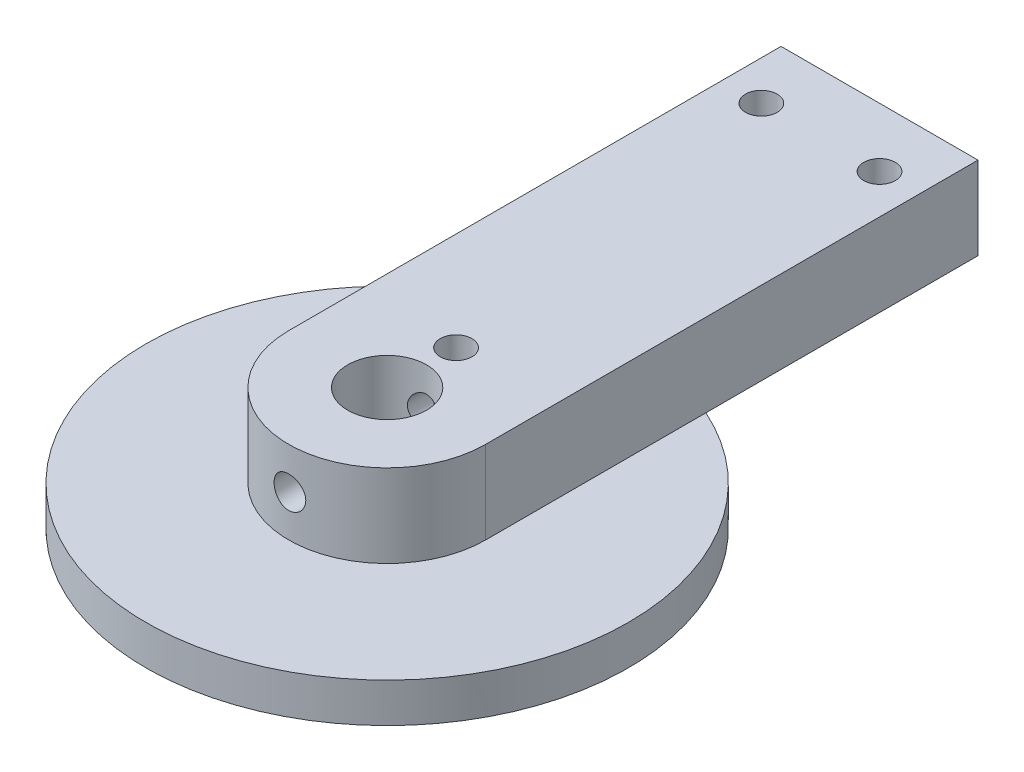
ISO-10303-21;
HEADER;
FILE_DESCRIPTION(('STEP AP214'),'2;1');
FILE_NAME('part.step','',(''),(''),'','','');
FILE_SCHEMA(('AUTOMOTIVE_DESIGN { 1 0 10303 214 1 1 1 1 }'));
ENDSEC;
DATA;
#1=APPLICATION_CONTEXT('core data for automotive mechanical design processes');
#2=APPLICATION_PROTOCOL_DEFINITION('international standard','automotive_design',2000,#1);
#3=PRODUCT_CONTEXT('',#1,'mechanical');
#4=PRODUCT('Part','Part','',(#3));
#5=PRODUCT_RELATED_PRODUCT_CATEGORY('part','',(#4));
#6=PRODUCT_DEFINITION_FORMATION('','',#4);
#7=PRODUCT_DEFINITION_CONTEXT('part definition',#1,'design');
#8=PRODUCT_DEFINITION('design','',#6,#7);
#9=PRODUCT_DEFINITION_SHAPE('','',#8);
#10=(LENGTH_UNIT() NAMED_UNIT(*) SI_UNIT(.MILLI.,.METRE.));
#11=(NAMED_UNIT(*) PLANE_ANGLE_UNIT() SI_UNIT($,.RADIAN.));
#12=(NAMED_UNIT(*) SI_UNIT($,.STERADIAN.) SOLID_ANGLE_UNIT());
#13=UNCERTAINTY_MEASURE_WITH_UNIT(LENGTH_MEASURE(1.E-05),#10,'distance_accuracy_value','');
#14=(GEOMETRIC_REPRESENTATION_CONTEXT(3) GLOBAL_UNCERTAINTY_ASSIGNED_CONTEXT((#13)) GLOBAL_UNIT_ASSIGNED_CONTEXT((#10,
#11,#12)) REPRESENTATION_CONTEXT('',''));
#15=CARTESIAN_POINT('',(0.,0.,0.));
#16=DIRECTION('',(0.,0.,1.));
#17=DIRECTION('',(1.,0.,0.));
#18=AXIS2_PLACEMENT_3D('',#15,#16,#17);
#19=CARTESIAN_POINT('',(0.,6.67619513536902,-79.375));
#20=DIRECTION('',(0.,0.,-1.));
#21=DIRECTION('',(-1.,0.,0.));
#22=AXIS2_PLACEMENT_3D('',#19,#20,#21);
#23=CYLINDRICAL_SURFACE('',#22,2.55269999999998);
#24=CARTESIAN_POINT('',(0.,6.67619513536902,-79.375));
#25=DIRECTION('',(0.,0.,-1.));
#26=DIRECTION('',(-1.,0.,0.));
#27=AXIS2_PLACEMENT_3D('',#24,#25,#26);
#28=CIRCLE('',#27,2.55269999999999);
#29=CARTESIAN_POINT('',(-2.55269999999999,6.67619513536902,-79.375));
#30=VERTEX_POINT('',#29);
#31=EDGE_CURVE('E142',#30,#30,#28,.T.);
#32=ORIENTED_EDGE('',*,*,#31,.T.);
#33=EDGE_LOOP('',(#32));
#34=FACE_BOUND('',#33,.T.);
#35=CARTESIAN_POINT('',(0.,6.67619513536902,-11.1125));
#36=DIRECTION('',(0.,-0.707106781186547,-0.707106781186547));
#37=DIRECTION('',(0.,0.707106781186547,-0.707106781186547));
#38=AXIS2_PLACEMENT_3D('',#35,#36,#37);
#39=ELLIPSE('',#38,3.61006296066977,2.55269999999998);
#40=CARTESIAN_POINT('',(2.55269999999998,6.67619513536902,-11.1125));
#41=VERTEX_POINT('',#40);
#42=CARTESIAN_POINT('',(-2.55269999999998,6.67619513536902,-11.1125));
#43=VERTEX_POINT('',#42);
#44=EDGE_CURVE('E52',#41,#43,#39,.F.);
#45=ORIENTED_EDGE('',*,*,#44,.T.);
#46=CARTESIAN_POINT('',(0.,6.67619513536902,-11.1125));
#47=DIRECTION('',(0.,0.707106781186547,-0.707106781186547));
#48=DIRECTION('',(0.,-0.707106781186547,-0.707106781186547));
#49=AXIS2_PLACEMENT_3D('',#46,#47,#48);
#50=ELLIPSE('',#49,3.61006296066977,2.55269999999998);
#51=EDGE_CURVE('E12',#43,#41,#50,.F.);
#52=ORIENTED_EDGE('',*,*,#51,.T.);
#53=EDGE_LOOP('',(#45,#52));
#54=FACE_BOUND('',#53,.T.);
#55=ADVANCED_FACE('F38',(#34,#54),#23,.F.);
#56=CARTESIAN_POINT('',(0.,-4.7625,0.));
#57=DIRECTION('',(0.,-1.,0.));
#58=DIRECTION('',(0.,0.,-1.));
#59=AXIS2_PLACEMENT_3D('',#56,#57,#58);
#60=PLANE('',#59);
#61=CARTESIAN_POINT('',(0.,-4.7625,-11.1125));
#62=DIRECTION('',(0.,-1.,0.));
#63=DIRECTION('',(0.,0.,-1.));
#64=AXIS2_PLACEMENT_3D('',#61,#62,#63);
#65=CIRCLE('',#64,2.55269999999998);
#66=CARTESIAN_POINT('',(0.,-4.7625,-13.6652));
#67=VERTEX_POINT('',#66);
#68=EDGE_CURVE('E445',#67,#67,#65,.T.);
#69=ORIENTED_EDGE('',*,*,#68,.F.);
#70=EDGE_LOOP('',(#69));
#71=FACE_BOUND('',#70,.T.);
#72=CARTESIAN_POINT('',(0.,-4.7625,0.));
#73=DIRECTION('',(0.,1.,0.));
#74=DIRECTION('',(0.,0.,1.));
#75=AXIS2_PLACEMENT_3D('',#72,#73,#74);
#76=CIRCLE('',#75,6.35);
#77=CARTESIAN_POINT('',(0.,-4.7625,6.35));
#78=VERTEX_POINT('',#77);
#79=EDGE_CURVE('E149',#78,#78,#76,.T.);
#80=ORIENTED_EDGE('',*,*,#79,.T.);
#81=EDGE_LOOP('',(#80));
#82=FACE_BOUND('',#81,.T.);
#83=CARTESIAN_POINT('',(0.,-4.7625,0.));
#84=DIRECTION('',(0.,-1.,0.));
#85=DIRECTION('',(0.,0.,-1.));
#86=AXIS2_PLACEMENT_3D('',#83,#84,#85);
#87=CIRCLE('',#86,28.575);
#88=CARTESIAN_POINT('',(0.,-4.7625,-28.575));
#89=VERTEX_POINT('',#88);
#90=EDGE_CURVE('E101',#89,#89,#87,.F.);
#91=ORIENTED_EDGE('',*,*,#90,.F.);
#92=EDGE_LOOP('',(#91));
#93=FACE_BOUND('',#92,.T.);
#94=ADVANCED_FACE('F225',(#71,#82,#93),#60,.T.);
#95=CARTESIAN_POINT('',(0.,13.352390270738,0.));
#96=DIRECTION('',(0.,-1.,0.));
#97=DIRECTION('',(0.,0.,-1.));
#98=AXIS2_PLACEMENT_3D('',#95,#96,#97);
#99=CYLINDRICAL_SURFACE('',#98,15.875);
#100=CARTESIAN_POINT('',(-2.55269999999998,6.67619513536902,15.6684188005682));
#101=CARTESIAN_POINT('',(-2.55269421702429,6.81858337057183,15.6684213075761));
#102=CARTESIAN_POINT('',(-2.54074616648937,6.96105114669729,15.6703807733375));
#103=CARTESIAN_POINT('',(-2.49328747696049,7.24199445458756,15.6780004485777));
#104=CARTESIAN_POINT('',(-2.45775465288336,7.38046609928677,15.6836641423756));
#105=CARTESIAN_POINT('',(-2.3642246898089,7.64931035266627,15.6980345886033));
#106=CARTESIAN_POINT('',(-2.30624576638418,7.77968942937338,15.7067388729595));
#107=CARTESIAN_POINT('',(-2.16951391110434,8.02885321213302,15.7262068260587));
#108=CARTESIAN_POINT('',(-2.09076350622437,8.14763932613227,15.736970244252));
#109=CARTESIAN_POINT('',(-1.91395239807692,8.37135180737435,15.7594541669231));
#110=CARTESIAN_POINT('',(-1.81573834039578,8.47615626975943,15.7711818089928));
#111=CARTESIAN_POINT('',(-1.6031191944537,8.6678724748529,15.7942092572758));
#112=CARTESIAN_POINT('',(-1.48871317289836,8.75478318546759,15.80550903878));
#113=CARTESIAN_POINT('',(-1.24617092916904,8.90869960464129,15.8264828230326));
#114=CARTESIAN_POINT('',(-1.11796209880441,8.97559228132801,15.8361474645452));
#115=CARTESIAN_POINT('',(-0.851946766463865,9.08684769434277,15.8526827295399));
#116=CARTESIAN_POINT('',(-0.714140846441996,9.13121179542165,15.8595535222646));
#117=CARTESIAN_POINT('',(-0.434101249094811,9.1957790415053,15.8696765615113));
#118=CARTESIAN_POINT('',(-0.291915868756529,9.21618677955503,15.8729594328297));
#119=CARTESIAN_POINT('',(-0.00610368480078618,9.23289786165674,15.8756418646554));
#120=CARTESIAN_POINT('',(0.137523026746744,9.22920273569771,15.8750416716497));
#121=CARTESIAN_POINT('',(0.420743073143736,9.19797322666551,15.8700499252344));
#122=CARTESIAN_POINT('',(0.560361388754155,9.17065899890702,15.8656933860675));
#123=CARTESIAN_POINT('',(0.833006837524951,9.09331290569467,15.8537174689452));
#124=CARTESIAN_POINT('',(0.966033780853808,9.04328038637532,15.8460979970781));
#125=CARTESIAN_POINT('',(1.22237929250029,8.9216967681155,15.8283925067598));
#126=CARTESIAN_POINT('',(1.34565374559465,8.85005424018152,15.818296043058));
#127=CARTESIAN_POINT('',(1.57851407372252,8.68735117090641,15.7967595883054));
#128=CARTESIAN_POINT('',(1.68809891484346,8.59628916430693,15.7853194959031));
#129=CARTESIAN_POINT('',(1.8917689753526,8.39610901610732,15.7622168215726));
#130=CARTESIAN_POINT('',(1.98566512265019,8.286798527095,15.7505531861649));
#131=CARTESIAN_POINT('',(2.15381262182836,8.05387438806735,15.7284433673805));
#132=CARTESIAN_POINT('',(2.22806381592379,7.93026062318184,15.7179971937827));
#133=CARTESIAN_POINT('',(2.3548466137178,7.67202768294993,15.6995048081101));
#134=CARTESIAN_POINT('',(2.40735666600635,7.53739774509266,15.6914609796055));
#135=CARTESIAN_POINT('',(2.48896516765669,7.26107055321859,15.6787244285256));
#136=CARTESIAN_POINT('',(2.51806552755095,7.11937387694128,15.6740314324827));
#137=CARTESIAN_POINT('',(2.55176488015591,6.83462369590792,15.6685804494066));
#138=CARTESIAN_POINT('',(2.55663285023611,6.69160282328911,15.6677792660236));
#139=CARTESIAN_POINT('',(2.54244490894016,6.40678908925925,15.6700877012313));
#140=CARTESIAN_POINT('',(2.5233898551273,6.26499618401299,15.6731971796375));
#141=CARTESIAN_POINT('',(2.46212566734739,5.9875100947066,15.682936752433));
#142=CARTESIAN_POINT('',(2.42005238780704,5.85178612711247,15.6895461827001));
#143=CARTESIAN_POINT('',(2.31408811272271,5.58931586563896,15.705523712824));
#144=CARTESIAN_POINT('',(2.25019589379056,5.46257007564735,15.7148919673639));
#145=CARTESIAN_POINT('',(2.10176843471217,5.22045376670255,15.7354324591804));
#146=CARTESIAN_POINT('',(2.01706019026241,5.10519058778602,15.7466195346261));
#147=CARTESIAN_POINT('',(1.8296437947844,4.89041884236245,15.7694933040337));
#148=CARTESIAN_POINT('',(1.72693446847435,4.79091130534146,15.7811800305799));
#149=CARTESIAN_POINT('',(1.50524233629351,4.60949919510091,15.8038723483787));
#150=CARTESIAN_POINT('',(1.38611217405467,4.52777359546783,15.8148702858739));
#151=CARTESIAN_POINT('',(1.13565716043419,4.38549642641893,15.8348244904014));
#152=CARTESIAN_POINT('',(1.00433268219725,4.32494420937002,15.8437808198778));
#153=CARTESIAN_POINT('',(0.73375836410508,4.22701388871142,15.8586093102595));
#154=CARTESIAN_POINT('',(0.594543695370145,4.18954060727633,15.8644941226018));
#155=CARTESIAN_POINT('',(0.311695277823733,4.13852482483949,15.8725698708882));
#156=CARTESIAN_POINT('',(0.168061867287679,4.12498049657938,15.8747610888814));
#157=CARTESIAN_POINT('',(-0.117816353701131,4.12225677676087,15.8751991931853));
#158=CARTESIAN_POINT('',(-0.260058571128707,4.13280452240284,15.8734902522255));
#159=CARTESIAN_POINT('',(-0.540717899904298,4.17737728344147,15.8664098270789));
#160=CARTESIAN_POINT('',(-0.67913502915253,4.21140218895302,15.8610383600346));
#161=CARTESIAN_POINT('',(-0.948121419231941,4.30186154637854,15.847234005968));
#162=CARTESIAN_POINT('',(-1.0786981204829,4.35827435288604,15.8388040766476));
#163=CARTESIAN_POINT('',(-1.3285753097415,4.49187827503799,15.8198050943369));
#164=CARTESIAN_POINT('',(-1.44787532324973,4.56907026450156,15.8092359513916));
#165=CARTESIAN_POINT('',(-1.67319071262124,4.74301577798607,15.7869892769831));
#166=CARTESIAN_POINT('',(-1.77905031266291,4.83996974053222,15.7753010974093));
#167=CARTESIAN_POINT('',(-1.97309486630058,5.05026575084303,15.7522092161064));
#168=CARTESIAN_POINT('',(-2.06127567317059,5.16361163277851,15.7408055816679));
#169=CARTESIAN_POINT('',(-2.21798489878607,5.40435067877194,15.7194936775308));
#170=CARTESIAN_POINT('',(-2.28638114752128,5.53183078661779,15.7095956651329));
#171=CARTESIAN_POINT('',(-2.40068555374764,5.79657456252965,15.6925365184406));
#172=CARTESIAN_POINT('',(-2.44661649519712,5.93382815591365,15.6853726128857));
#173=CARTESIAN_POINT('',(-2.50454732687514,6.17240491253714,15.6762058286717));
#174=CARTESIAN_POINT('',(-2.52257610162269,6.2722725397377,15.6733016531558));
#175=CARTESIAN_POINT('',(-2.54665440016736,6.47347839850198,15.669407262079));
#176=CARTESIAN_POINT('',(-2.55270411740173,6.57481660629221,15.668417015612));
#177=CARTESIAN_POINT('',(-2.55269999999998,6.67619513536902,15.6684188005682));
#178=B_SPLINE_CURVE_WITH_KNOTS('',3,(#100,#101,#102,#103,#104,#105,#106,#107,#108,#109,#110,
#111,#112,#113,#114,#115,#116,#117,#118,#119,#120,#121,#122,#123,#124,#125,#126,#127,#128,#129,
#130,#131,#132,#133,#134,#135,#136,#137,#138,#139,#140,#141,#142,#143,#144,#145,#146,#147,#148,
#149,#150,#151,#152,#153,#154,#155,#156,#157,#158,#159,#160,#161,#162,#163,#164,#165,#166,#167,
#168,#169,#170,#171,#172,#173,#174,#175,#176,#177),.UNSPECIFIED.,.T.,.F.,(4,2,2,2,2,2,2,2,2,2,2,
2,2,2,2,2,2,2,2,2,2,2,2,2,2,2,2,2,2,2,2,2,2,2,2,2,2,2,4),(0.,0.426794046832573,
0.853990128709808,1.28084025451386,1.70763847537528,2.13794366991312,2.56827367707512,
3.00098958348056,3.43367927340975,3.86264616780719,4.29158583273367,4.71656989801847,
5.14156619573863,5.568386434729,5.99523888999784,6.42691319835398,6.85859097374436,
7.2906956411128,7.72276503959478,8.15002764276479,8.57727493038522,9.00202737321335,
9.42680363582704,9.85523731672571,10.2836989802764,10.7162917565423,11.1488712998773,
11.5796547200504,12.0104052433967,12.4363013825917,12.8621955283883,13.2876789040767,
13.7131801752523,14.1432335454077,14.5733876708807,15.0063523528909,15.43887701376,
15.7427536038985,16.0466252870119),.UNSPECIFIED.);
#179=CARTESIAN_POINT('',(-2.55269999999998,6.67619513536902,15.6684188005682));
#180=VERTEX_POINT('',#179);
#181=EDGE_CURVE('E114',#180,#180,#178,.T.);
#182=ORIENTED_EDGE('',*,*,#181,.T.);
#183=EDGE_LOOP('',(#182));
#184=FACE_BOUND('',#183,.T.);
#185=CARTESIAN_POINT('',(0.,0.,0.));
#186=DIRECTION('',(0.,1.,0.));
#187=DIRECTION('',(0.,0.,1.));
#188=AXIS2_PLACEMENT_3D('',#185,#186,#187);
#189=CIRCLE('',#188,15.875);
#190=CARTESIAN_POINT('',(-15.875,0.,0.));
#191=VERTEX_POINT('',#190);
#192=CARTESIAN_POINT('',(15.875,0.,0.));
#193=VERTEX_POINT('',#192);
#194=EDGE_CURVE('E158',#191,#193,#189,.T.);
#195=ORIENTED_EDGE('',*,*,#194,.T.);
#196=DIRECTION('',(0.,-1.,0.));
#197=VECTOR('',#196,1.);
#198=CARTESIAN_POINT('',(15.875,13.352390270738,0.));
#199=LINE('',#198,#197);
#200=CARTESIAN_POINT('',(15.875,13.352390270738,0.));
#201=VERTEX_POINT('',#200);
#202=EDGE_CURVE('E187',#201,#193,#199,.T.);
#203=ORIENTED_EDGE('',*,*,#202,.F.);
#204=CARTESIAN_POINT('',(0.,13.352390270738,0.));
#205=DIRECTION('',(0.,1.,0.));
#206=DIRECTION('',(0.,0.,1.));
#207=AXIS2_PLACEMENT_3D('',#204,#205,#206);
#208=CIRCLE('',#207,15.875);
#209=CARTESIAN_POINT('',(-15.875,13.352390270738,0.));
#210=VERTEX_POINT('',#209);
#211=EDGE_CURVE('E159',#210,#201,#208,.T.);
#212=ORIENTED_EDGE('',*,*,#211,.F.);
#213=DIRECTION('',(0.,-1.,0.));
#214=VECTOR('',#213,1.);
#215=CARTESIAN_POINT('',(-15.875,13.352390270738,0.));
#216=LINE('',#215,#214);
#217=EDGE_CURVE('E169',#210,#191,#216,.T.);
#218=ORIENTED_EDGE('',*,*,#217,.T.);
#219=EDGE_LOOP('',(#195,#203,#212,#218));
#220=FACE_BOUND('',#219,.T.);
#221=ADVANCED_FACE('F40',(#184,#220),#99,.T.);
#222=CARTESIAN_POINT('',(15.875,13.352390270738,-79.375));
#223=DIRECTION('',(-1.,0.,0.));
#224=DIRECTION('',(0.,0.,1.));
#225=AXIS2_PLACEMENT_3D('',#222,#223,#224);
#226=PLANE('',#225);
#227=DIRECTION('',(0.,0.,-1.));
#228=VECTOR('',#227,1.);
#229=CARTESIAN_POINT('',(15.875,0.,-79.375));
#230=LINE('',#229,#228);
#231=CARTESIAN_POINT('',(15.875,0.,-35.5064524285728));
#232=VERTEX_POINT('',#231);
#233=EDGE_CURVE('E173',#193,#232,#230,.T.);
#234=ORIENTED_EDGE('',*,*,#233,.T.);
#235=CARTESIAN_POINT('',(15.875,0.,-79.375));
#236=VERTEX_POINT('',#235);
#237=EDGE_CURVE('E172',#232,#236,#230,.T.);
#238=ORIENTED_EDGE('',*,*,#237,.T.);
#239=DIRECTION('',(0.,-1.,0.));
#240=VECTOR('',#239,1.);
#241=CARTESIAN_POINT('',(15.875,13.352390270738,-79.375));
#242=LINE('',#241,#240);
#243=CARTESIAN_POINT('',(15.875,13.352390270738,-79.375));
#244=VERTEX_POINT('',#243);
#245=EDGE_CURVE('E184',#244,#236,#242,.T.);
#246=ORIENTED_EDGE('',*,*,#245,.F.);
#247=DIRECTION('',(0.,0.,-1.));
#248=VECTOR('',#247,1.);
#249=CARTESIAN_POINT('',(15.875,13.352390270738,-79.375));
#250=LINE('',#249,#248);
#251=EDGE_CURVE('E162',#201,#244,#250,.T.);
#252=ORIENTED_EDGE('',*,*,#251,.F.);
#253=ORIENTED_EDGE('',*,*,#202,.T.);
#254=EDGE_LOOP('',(#234,#238,#246,#252,#253));
#255=FACE_BOUND('',#254,.T.);
#256=ADVANCED_FACE('F217',(#255),#226,.F.);
#257=CARTESIAN_POINT('',(-15.875,13.352390270738,-79.375));
#258=DIRECTION('',(0.,0.,1.));
#259=DIRECTION('',(1.,0.,0.));
#260=AXIS2_PLACEMENT_3D('',#257,#258,#259);
#261=PLANE('',#260);
#262=ORIENTED_EDGE('',*,*,#31,.F.);
#263=EDGE_LOOP('',(#262));
#264=FACE_BOUND('',#263,.T.);
#265=DIRECTION('',(-1.,0.,0.));
#266=VECTOR('',#265,1.);
#267=CARTESIAN_POINT('',(-15.875,0.,-79.375));
#268=LINE('',#267,#266);
#269=CARTESIAN_POINT('',(-15.875,0.,-79.375));
#270=VERTEX_POINT('',#269);
#271=EDGE_CURVE('E175',#236,#270,#268,.T.);
#272=ORIENTED_EDGE('',*,*,#271,.T.);
#273=DIRECTION('',(0.,-1.,0.));
#274=VECTOR('',#273,1.);
#275=CARTESIAN_POINT('',(-15.875,13.352390270738,-79.375));
#276=LINE('',#275,#274);
#277=CARTESIAN_POINT('',(-15.875,13.352390270738,-79.375));
#278=VERTEX_POINT('',#277);
#279=EDGE_CURVE('E181',#278,#270,#276,.T.);
#280=ORIENTED_EDGE('',*,*,#279,.F.);
#281=DIRECTION('',(-1.,0.,0.));
#282=VECTOR('',#281,1.);
#283=CARTESIAN_POINT('',(-15.875,13.352390270738,-79.375));
#284=LINE('',#283,#282);
#285=EDGE_CURVE('E165',#244,#278,#284,.T.);
#286=ORIENTED_EDGE('',*,*,#285,.F.);
#287=ORIENTED_EDGE('',*,*,#245,.T.);
#288=EDGE_LOOP('',(#272,#280,#286,#287));
#289=FACE_BOUND('',#288,.T.);
#290=ADVANCED_FACE('F215',(#264,#289),#261,.F.);
#291=CARTESIAN_POINT('',(-15.875,13.352390270738,0.));
#292=DIRECTION('',(1.,0.,0.));
#293=DIRECTION('',(0.,0.,-1.));
#294=AXIS2_PLACEMENT_3D('',#291,#292,#293);
#295=PLANE('',#294);
#296=DIRECTION('',(0.,0.,1.));
#297=VECTOR('',#296,1.);
#298=CARTESIAN_POINT('',(-15.875,0.,0.));
#299=LINE('',#298,#297);
#300=CARTESIAN_POINT('',(-15.875,0.,-35.5064524285728));
#301=VERTEX_POINT('',#300);
#302=EDGE_CURVE('E163',#270,#301,#299,.T.);
#303=ORIENTED_EDGE('',*,*,#302,.T.);
#304=EDGE_CURVE('E177',#301,#191,#299,.T.);
#305=ORIENTED_EDGE('',*,*,#304,.T.);
#306=ORIENTED_EDGE('',*,*,#217,.F.);
#307=DIRECTION('',(0.,0.,1.));
#308=VECTOR('',#307,1.);
#309=CARTESIAN_POINT('',(-15.875,13.352390270738,0.));
#310=LINE('',#309,#308);
#311=EDGE_CURVE('E167',#278,#210,#310,.T.);
#312=ORIENTED_EDGE('',*,*,#311,.F.);
#313=ORIENTED_EDGE('',*,*,#279,.T.);
#314=EDGE_LOOP('',(#303,#305,#306,#312,#313));
#315=FACE_BOUND('',#314,.T.);
#316=ADVANCED_FACE('F202',(#315),#295,.F.);
#317=CARTESIAN_POINT('',(0.,13.352390270738,0.));
#318=DIRECTION('',(0.,1.,0.));
#319=DIRECTION('',(0.,0.,1.));
#320=AXIS2_PLACEMENT_3D('',#317,#318,#319);
#321=PLANE('',#320);
#322=CARTESIAN_POINT('',(-9.52500000003406,13.3523902707381,-69.8499999999932));
#323=DIRECTION('',(0.,1.,0.));
#324=DIRECTION('',(0.,0.,1.));
#325=AXIS2_PLACEMENT_3D('',#322,#323,#324);
#326=CIRCLE('',#325,2.55269999999999);
#327=CARTESIAN_POINT('',(-9.52500000003406,13.3523902707381,-67.2972999999932));
#328=VERTEX_POINT('',#327);
#329=EDGE_CURVE('E430',#328,#328,#326,.T.);
#330=ORIENTED_EDGE('',*,*,#329,.F.);
#331=EDGE_LOOP('',(#330));
#332=FACE_BOUND('',#331,.T.);
#333=CARTESIAN_POINT('',(9.52499999996594,13.3523902707381,-69.8499999999932));
#334=DIRECTION('',(0.,1.,0.));
#335=DIRECTION('',(0.,0.,1.));
#336=AXIS2_PLACEMENT_3D('',#333,#334,#335);
#337=CIRCLE('',#336,2.55269999999999);
#338=CARTESIAN_POINT('',(9.52499999996594,13.3523902707381,-67.2972999999932));
#339=VERTEX_POINT('',#338);
#340=EDGE_CURVE('E434',#339,#339,#337,.T.);
#341=ORIENTED_EDGE('',*,*,#340,.F.);
#342=EDGE_LOOP('',(#341));
#343=FACE_BOUND('',#342,.T.);
#344=CARTESIAN_POINT('',(0.,13.3523902707381,-11.1125));
#345=DIRECTION('',(0.,1.,0.));
#346=DIRECTION('',(0.,0.,1.));
#347=AXIS2_PLACEMENT_3D('',#344,#345,#346);
#348=CIRCLE('',#347,2.55269999999999);
#349=CARTESIAN_POINT('',(0.,13.3523902707381,-8.5598));
#350=VERTEX_POINT('',#349);
#351=EDGE_CURVE('E443',#350,#350,#348,.T.);
#352=ORIENTED_EDGE('',*,*,#351,.F.);
#353=EDGE_LOOP('',(#352));
#354=FACE_BOUND('',#353,.T.);
#355=CARTESIAN_POINT('',(0.,13.352390270738,0.));
#356=DIRECTION('',(0.,1.,0.));
#357=DIRECTION('',(0.,0.,1.));
#358=AXIS2_PLACEMENT_3D('',#355,#356,#357);
#359=CIRCLE('',#358,6.35);
#360=CARTESIAN_POINT('',(0.,13.352390270738,6.35));
#361=VERTEX_POINT('',#360);
#362=EDGE_CURVE('E152',#361,#361,#359,.T.);
#363=ORIENTED_EDGE('',*,*,#362,.F.);
#364=EDGE_LOOP('',(#363));
#365=FACE_BOUND('',#364,.T.);
#366=ORIENTED_EDGE('',*,*,#211,.T.);
#367=ORIENTED_EDGE('',*,*,#251,.T.);
#368=ORIENTED_EDGE('',*,*,#285,.T.);
#369=ORIENTED_EDGE('',*,*,#311,.T.);
#370=EDGE_LOOP('',(#366,#367,#368,#369));
#371=FACE_BOUND('',#370,.T.);
#372=ADVANCED_FACE('F208',(#332,#343,#354,#365,#371),#321,.T.);
#373=CARTESIAN_POINT('',(0.,0.,0.));
#374=DIRECTION('',(0.,1.,0.));
#375=DIRECTION('',(0.,0.,1.));
#376=AXIS2_PLACEMENT_3D('',#373,#374,#375);
#377=PLANE('',#376);
#378=CARTESIAN_POINT('',(-9.52500000003406,0.,-69.8499999999932));
#379=DIRECTION('',(0.,1.,0.));
#380=DIRECTION('',(0.,0.,1.));
#381=AXIS2_PLACEMENT_3D('',#378,#379,#380);
#382=CIRCLE('',#381,2.55269999999998);
#383=CARTESIAN_POINT('',(-9.52500000003406,0.,-67.2972999999932));
#384=VERTEX_POINT('',#383);
#385=EDGE_CURVE('E433',#384,#384,#382,.T.);
#386=ORIENTED_EDGE('',*,*,#385,.T.);
#387=EDGE_LOOP('',(#386));
#388=FACE_BOUND('',#387,.T.);
#389=CARTESIAN_POINT('',(9.52499999996594,0.,-69.8499999999932));
#390=DIRECTION('',(0.,1.,0.));
#391=DIRECTION('',(0.,0.,1.));
#392=AXIS2_PLACEMENT_3D('',#389,#390,#391);
#393=CIRCLE('',#392,2.55269999999998);
#394=CARTESIAN_POINT('',(9.52499999996594,0.,-67.2972999999932));
#395=VERTEX_POINT('',#394);
#396=EDGE_CURVE('E437',#395,#395,#393,.T.);
#397=ORIENTED_EDGE('',*,*,#396,.T.);
#398=EDGE_LOOP('',(#397));
#399=FACE_BOUND('',#398,.T.);
#400=CARTESIAN_POINT('',(0.,0.,0.));
#401=DIRECTION('',(0.,-1.,0.));
#402=DIRECTION('',(0.,0.,-1.));
#403=AXIS2_PLACEMENT_3D('',#400,#401,#402);
#404=CIRCLE('',#403,38.89375);
#405=EDGE_CURVE('E60',#301,#232,#404,.T.);
#406=ORIENTED_EDGE('',*,*,#405,.F.);
#407=ORIENTED_EDGE('',*,*,#302,.F.);
#408=ORIENTED_EDGE('',*,*,#271,.F.);
#409=ORIENTED_EDGE('',*,*,#237,.F.);
#410=EDGE_LOOP('',(#406,#407,#408,#409));
#411=FACE_BOUND('',#410,.T.);
#412=ADVANCED_FACE('F214',(#388,#399,#411),#377,.F.);
#413=CARTESIAN_POINT('',(0.,-4.7625,0.));
#414=DIRECTION('',(0.,1.,0.));
#415=DIRECTION('',(0.,0.,1.));
#416=AXIS2_PLACEMENT_3D('',#413,#414,#415);
#417=CYLINDRICAL_SURFACE('',#416,38.89375);
#418=EDGE_CURVE('E155',#232,#301,#404,.T.);
#419=ORIENTED_EDGE('',*,*,#418,.T.);
#420=ORIENTED_EDGE('',*,*,#405,.T.);
#421=EDGE_LOOP('',(#419,#420));
#422=FACE_BOUND('',#421,.T.);
#423=CARTESIAN_POINT('',(0.,-6.35,0.));
#424=DIRECTION('',(0.,-1.,0.));
#425=DIRECTION('',(0.,0.,-1.));
#426=AXIS2_PLACEMENT_3D('',#423,#424,#425);
#427=CIRCLE('',#426,38.89375);
#428=CARTESIAN_POINT('',(0.,-6.35,-38.89375));
#429=VERTEX_POINT('',#428);
#430=EDGE_CURVE('E146',#429,#429,#427,.T.);
#431=ORIENTED_EDGE('',*,*,#430,.F.);
#432=EDGE_LOOP('',(#431));
#433=FACE_BOUND('',#432,.T.);
#434=ADVANCED_FACE('F193',(#422,#433),#417,.T.);
#435=CARTESIAN_POINT('',(0.,0.,0.));
#436=DIRECTION('',(0.,-1.,0.));
#437=DIRECTION('',(0.,0.,-1.));
#438=AXIS2_PLACEMENT_3D('',#435,#436,#437);
#439=PLANE('',#438);
#440=ORIENTED_EDGE('',*,*,#304,.F.);
#441=ORIENTED_EDGE('',*,*,#418,.F.);
#442=ORIENTED_EDGE('',*,*,#233,.F.);
#443=ORIENTED_EDGE('',*,*,#194,.F.);
#444=EDGE_LOOP('',(#440,#441,#442,#443));
#445=FACE_BOUND('',#444,.T.);
#446=ADVANCED_FACE('F198',(#445),#439,.F.);
#447=CARTESIAN_POINT('',(0.,-4.7625,0.));
#448=DIRECTION('',(0.,1.,0.));
#449=DIRECTION('',(0.,0.,1.));
#450=AXIS2_PLACEMENT_3D('',#447,#448,#449);
#451=CYLINDRICAL_SURFACE('',#450,6.35);
#452=CARTESIAN_POINT('',(0.,4.12349513536904,6.35));
#453=CARTESIAN_POINT('',(0.137152590563424,4.12350447436471,6.34999304806874));
#454=CARTESIAN_POINT('',(0.274526179298314,4.13461223333922,6.34550570854028));
#455=CARTESIAN_POINT('',(0.545406210867714,4.17864910191596,6.32799859624412));
#456=CARTESIAN_POINT('',(0.678901166129095,4.21163725977312,6.31495573589492));
#457=CARTESIAN_POINT('',(0.937658479293736,4.2980425788321,6.2817396684711));
#458=CARTESIAN_POINT('',(1.06294633311217,4.3513925766835,6.26158991981214));
#459=CARTESIAN_POINT('',(1.30267951928128,4.47673825447462,6.21614281942444));
#460=CARTESIAN_POINT('',(1.41712854004813,4.54872756015991,6.19084722809909));
#461=CARTESIAN_POINT('',(1.63753539441425,4.71292057807482,6.13631999828523));
#462=CARTESIAN_POINT('',(1.74291121266192,4.80586442551895,6.1069653774522));
#463=CARTESIAN_POINT('',(1.93707323593064,5.00776566261223,6.04818638952131));
#464=CARTESIAN_POINT('',(2.02585125334071,5.11673090843875,6.01876199521394));
#465=CARTESIAN_POINT('',(2.18823813167983,5.35354227998069,5.96169986279921));
#466=CARTESIAN_POINT('',(2.26098339858473,5.48201786299655,5.93420233969044));
#467=CARTESIAN_POINT('',(2.38357178435738,5.75065159199667,5.88603907626437));
#468=CARTESIAN_POINT('',(2.43342588991174,5.89080409536407,5.86537005992217));
#469=CARTESIAN_POINT('',(2.50645706114518,6.17212416190255,5.83452558981197));
#470=CARTESIAN_POINT('',(2.53074906305578,6.31295268266661,5.82391378021108));
#471=CARTESIAN_POINT('',(2.55544871456328,6.59705613591029,5.81312158743501));
#472=CARTESIAN_POINT('',(2.55586827216114,6.74032981302394,5.81293600347312));
#473=CARTESIAN_POINT('',(2.53365545339496,7.01449680700413,5.82264534091095));
#474=CARTESIAN_POINT('',(2.51264426262922,7.1455514753574,5.83183133573759));
#475=CARTESIAN_POINT('',(2.45087143364755,7.40208818161305,5.85805796981581));
#476=CARTESIAN_POINT('',(2.41010631071101,7.52756923202824,5.87509999489579));
#477=CARTESIAN_POINT('',(2.30920424806731,7.77244127739415,5.91549406542854));
#478=CARTESIAN_POINT('',(2.24868698427878,7.89165448114037,5.93896841007289));
#479=CARTESIAN_POINT('',(2.11026573362478,8.11867491112062,5.98954915060851));
#480=CARTESIAN_POINT('',(2.03235517588614,8.22647780399626,6.01665691759063));
#481=CARTESIAN_POINT('',(1.85420353945378,8.43648294038764,6.07402992197142));
#482=CARTESIAN_POINT('',(1.75269319282267,8.53758916075072,6.10437636024199));
#483=CARTESIAN_POINT('',(1.533837124988,8.72169599354319,6.16300797653218));
#484=CARTESIAN_POINT('',(1.41648819460131,8.8046929277634,6.19129273502491));
#485=CARTESIAN_POINT('',(1.16615109270642,8.95168318509693,6.24333551925189));
#486=CARTESIAN_POINT('',(1.03289559737698,9.01526021569103,6.26699093045802));
#487=CARTESIAN_POINT('',(0.756388475795008,9.11871678890232,6.30633251872665));
#488=CARTESIAN_POINT('',(0.613142022475441,9.15860849456944,6.32202278550323));
#489=CARTESIAN_POINT('',(0.329902950281624,9.2113362826028,6.34291864136937));
#490=CARTESIAN_POINT('',(0.190226394779014,9.22564504426869,6.34869410367057));
#491=CARTESIAN_POINT('',(-0.0896381983188432,9.23115422078598,6.35090754458063));
#492=CARTESIAN_POINT('',(-0.229826092046453,9.22236069976291,6.3473479735458));
#493=CARTESIAN_POINT('',(-0.500032677309312,9.18299446748888,6.33166393929384));
#494=CARTESIAN_POINT('',(-0.630223897491495,9.15343044307577,6.31993636241371));
#495=CARTESIAN_POINT('',(-0.883675174685727,9.07473861276765,6.28950889121095));
#496=CARTESIAN_POINT('',(-1.00693434052695,9.02560829800137,6.27080810277367));
#497=CARTESIAN_POINT('',(-1.24727618501287,8.90757456016023,6.2275337552144));
#498=CARTESIAN_POINT('',(-1.36405364068129,8.83811109750721,6.20279772189873));
#499=CARTESIAN_POINT('',(-1.5847059937915,8.68200346716827,6.15012973013763));
#500=CARTESIAN_POINT('',(-1.68857566450019,8.59535237635082,6.1221964857879));
#501=CARTESIAN_POINT('',(-1.88773053063361,8.40055588115687,6.06386438406277));
#502=CARTESIAN_POINT('',(-1.98198169049622,8.29136259674997,6.03342530552616));
#503=CARTESIAN_POINT('',(-2.15108053830993,8.0581772820748,5.9752297659637));
#504=CARTESIAN_POINT('',(-2.22592489421887,7.93418271583738,5.94747376612021));
#505=CARTESIAN_POINT('',(-2.35459646292972,7.67296589092587,5.89772885227325));
#506=CARTESIAN_POINT('',(-2.40820159223356,7.5356216472802,5.87580162831969));
#507=CARTESIAN_POINT('',(-2.49110345882803,7.25270707241326,5.84114379091715));
#508=CARTESIAN_POINT('',(-2.52041838243924,7.10714298285583,5.82840629794991));
#509=CARTESIAN_POINT('',(-2.5521621730446,6.82330425292314,5.81457137458616));
#510=CARTESIAN_POINT('',(-2.55638784616147,6.68526725899995,5.81269627568293));
#511=CARTESIAN_POINT('',(-2.54256086608562,6.41054711322747,5.81875771897436));
#512=CARTESIAN_POINT('',(-2.5245111062549,6.27386378787418,5.82669298689808));
#513=CARTESIAN_POINT('',(-2.46811809715364,6.01138458887856,5.85079208061455));
#514=CARTESIAN_POINT('',(-2.43062291862307,5.88537194272122,5.86661102925356));
#515=CARTESIAN_POINT('',(-2.33720121100693,5.64137810191873,5.90444895134407));
#516=CARTESIAN_POINT('',(-2.28126958060273,5.52339914108751,5.92646964055536));
#517=CARTESIAN_POINT('',(-2.14883980056634,5.29141430497786,5.97580512840318));
#518=CARTESIAN_POINT('',(-2.07134234595149,5.17802900532813,6.00335185546816));
#519=CARTESIAN_POINT('',(-1.89943729526244,4.96530872463309,6.05993579915212));
#520=CARTESIAN_POINT('',(-1.80502450937541,4.8659780724979,6.08897347125354));
#521=CARTESIAN_POINT('',(-1.59456803133812,4.67748079494443,6.14756260987943));
#522=CARTESIAN_POINT('',(-1.47751013231649,4.58941218744073,6.17702228110564));
#523=CARTESIAN_POINT('',(-1.22920158030934,4.43414211063231,6.23118918201763));
#524=CARTESIAN_POINT('',(-1.09794438564991,4.36695031503189,6.25589420652727));
#525=CARTESIAN_POINT('',(-0.82714956024147,4.25689557785512,6.29735329315789));
#526=CARTESIAN_POINT('',(-0.687808846675029,4.21360753592578,6.31424535261243));
#527=CARTESIAN_POINT('',(-0.474582491070505,4.16694044418888,6.33264571166289));
#528=CARTESIAN_POINT('',(-0.402870618992053,4.15443196250839,6.33762151518832));
#529=CARTESIAN_POINT('',(-0.258527172772293,4.13558118421653,6.34514446855661));
#530=CARTESIAN_POINT('',(-0.185896283634975,4.12923454081097,6.34769333043157));
#531=CARTESIAN_POINT('',(-0.0754545673581375,4.12433014623735,6.34966466033005));
#532=CARTESIAN_POINT('',(-0.0377356484545645,4.12349256587287,6.35000191272825));
#533=CARTESIAN_POINT('',(0.,4.12349513536904,6.35));
#534=B_SPLINE_CURVE_WITH_KNOTS('',3,(#452,#453,#454,#455,#456,#457,#458,#459,#460,#461,#462,
#463,#464,#465,#466,#467,#468,#469,#470,#471,#472,#473,#474,#475,#476,#477,#478,#479,#480,#481,
#482,#483,#484,#485,#486,#487,#488,#489,#490,#491,#492,#493,#494,#495,#496,#497,#498,#499,#500,
#501,#502,#503,#504,#505,#506,#507,#508,#509,#510,#511,#512,#513,#514,#515,#516,#517,#518,#519,
#520,#521,#522,#523,#524,#525,#526,#527,#528,#529,#530,#531,#532,#533),.UNSPECIFIED.,.T.,.F.,(4,
2,2,2,2,2,2,2,2,2,2,2,2,2,2,2,2,2,2,2,2,2,2,2,2,2,2,2,2,2,2,2,2,2,2,2,2,2,2,2,4),(0.,
0.411331059515127,0.823776712244992,1.2348735124512,1.64582991138899,2.07457553263974,
2.50353209708504,2.95181404932942,3.39988062173096,3.82747226722298,4.25485062050568,
4.65213393839022,5.04948736513309,5.45499402143404,5.86065413086399,6.29801539594672,
6.73546541172749,7.18172360768625,7.62775243943508,8.04716062825995,8.46645873749574,
8.86668753121302,9.2669676604653,9.67951990853165,10.092238670252,10.5324737496029,
10.9727843649352,11.4175846218039,11.8620515505695,12.2742621542482,12.6864192214154,
13.0819487597493,13.4775878320836,13.8960224723141,14.3145857135078,14.760675264033,
15.2069712122025,15.6450512739016,15.8636998845329,16.0821941398344,16.1953662220863),.UNSPECIFIED.);
#535=CARTESIAN_POINT('',(0.,4.12349513536904,6.35));
#536=VERTEX_POINT('',#535);
#537=EDGE_CURVE('E106',#536,#536,#534,.T.);
#538=ORIENTED_EDGE('',*,*,#537,.T.);
#539=EDGE_LOOP('',(#538));
#540=FACE_BOUND('',#539,.T.);
#541=CARTESIAN_POINT('',(-2.55269999999998,6.67619513536902,-5.81431188619944));
#542=CARTESIAN_POINT('',(-2.5526905630964,6.81283936624545,-5.81432078402574));
#543=CARTESIAN_POINT('',(-2.54166134032132,6.94971163642389,-5.81919700132078));
#544=CARTESIAN_POINT('',(-2.49796596910942,7.21954225423455,-5.83808211567229));
#545=CARTESIAN_POINT('',(-2.46523924855455,7.35248855349086,-5.85211657773723));
#546=CARTESIAN_POINT('',(-2.37959664756675,7.610080162954,-5.88745604297276));
#547=CARTESIAN_POINT('',(-2.32675919778155,7.73475553871387,-5.90873276809912));
#548=CARTESIAN_POINT('',(-2.20262513348527,7.97343326563676,-5.95611774120807));
#549=CARTESIAN_POINT('',(-2.13133377756777,8.08743864472339,-5.98222461219698));
#550=CARTESIAN_POINT('',(-1.96790421530299,8.3082074247132,-6.03801938358332));
#551=CARTESIAN_POINT('',(-1.87486906879552,8.41427786372061,-6.06782326655497));
#552=CARTESIAN_POINT('',(-1.6724791727677,8.60981904271871,-6.12669683253183));
#553=CARTESIAN_POINT('',(-1.56311840670105,8.69928363550591,-6.15576624022034));
#554=CARTESIAN_POINT('',(-1.32582206886514,8.86252022379101,-6.21128853107451));
#555=CARTESIAN_POINT('',(-1.1973196171568,8.9355240070088,-6.23759081198171));
#556=CARTESIAN_POINT('',(-0.928611352433399,9.05858218483035,-6.28320858537361));
#557=CARTESIAN_POINT('',(-0.78841042352682,9.10864610070701,-6.30252697584282));
#558=CARTESIAN_POINT('',(-0.507548787551625,9.18192720737412,-6.33117951825309));
#559=CARTESIAN_POINT('',(-0.367245002117871,9.20633623204089,-6.34095524133267));
#560=CARTESIAN_POINT('',(-0.0842150844863431,9.23145401938479,-6.35101796268605));
#561=CARTESIAN_POINT('',(0.0585101161861166,9.23217169822238,-6.35130853066648));
#562=CARTESIAN_POINT('',(0.333710031061518,9.2105363949628,-6.34263586649893));
#563=CARTESIAN_POINT('',(0.466306963825216,9.18948974714813,-6.33419660528565));
#564=CARTESIAN_POINT('',(0.725902511462746,9.12714726683943,-6.30972037363822));
#565=CARTESIAN_POINT('',(0.852900714777186,9.08584994842637,-6.29368284567438));
#566=CARTESIAN_POINT('',(1.09998813694323,8.98367277074593,-6.25527046131839));
#567=CARTESIAN_POINT('',(1.21994406479174,8.92250661684661,-6.2328035633657));
#568=CARTESIAN_POINT('',(1.44819941289693,8.78259769830084,-6.18375837613325));
#569=CARTESIAN_POINT('',(1.55649480248873,8.70384888463357,-6.15717867287982));
#570=CARTESIAN_POINT('',(1.76597068355901,8.52493273540736,-6.10052388853339));
#571=CARTESIAN_POINT('',(1.86620487380284,8.42369224869807,-6.07033389818242));
#572=CARTESIAN_POINT('',(2.04866288569323,8.20572710195815,-6.01121444813448));
#573=CARTESIAN_POINT('',(2.13088069162061,8.08899729082521,-5.98228541204861));
#574=CARTESIAN_POINT('',(2.27716736164087,7.83909437040547,-5.9281771467625));
#575=CARTESIAN_POINT('',(2.34064590181745,7.70554475258913,-5.90312977428897));
#576=CARTESIAN_POINT('',(2.44383495799582,7.42837634975415,-5.86116973103554));
#577=CARTESIAN_POINT('',(2.48356109506871,7.28476425204715,-5.84425171532117));
#578=CARTESIAN_POINT('',(2.53580333869795,7.00099280262202,-5.82176658887495));
#579=CARTESIAN_POINT('',(2.54984384787793,6.86116507375667,-5.81556487076881));
#580=CARTESIAN_POINT('',(2.55476599792041,6.5810444096546,-5.81340577657356));
#581=CARTESIAN_POINT('',(2.54565477290826,6.44075163102621,-5.81744524469811));
#582=CARTESIAN_POINT('',(2.5059204458589,6.17220664108807,-5.83466155913691));
#583=CARTESIAN_POINT('',(2.47657052213051,6.04372706099395,-5.84729704529561));
#584=CARTESIAN_POINT('',(2.39884779744967,5.79360368180752,-5.87960775619754));
#585=CARTESIAN_POINT('',(2.35047075117551,5.67196141518041,-5.8992845519057));
#586=CARTESIAN_POINT('',(2.23386605597051,5.43343224614706,-5.94444209650168));
#587=CARTESIAN_POINT('',(2.16490933763852,5.3169415718401,-5.97012681142418));
#588=CARTESIAN_POINT('',(2.00984566106221,5.09665134754256,-6.02409766095458));
#589=CARTESIAN_POINT('',(1.92373166630731,4.99285703284061,-6.05238486031824));
#590=CARTESIAN_POINT('',(1.72920025422651,4.79284046140604,-6.11092633204013));
#591=CARTESIAN_POINT('',(1.61959685835607,4.69776408761469,-6.14116959499678));
#592=CARTESIAN_POINT('',(1.38527123394112,4.52717213641465,-6.19822940764564));
#593=CARTESIAN_POINT('',(1.260548331023,4.45165743198443,-6.22504580438008));
#594=CARTESIAN_POINT('',(0.999035169083655,4.32259003140519,-6.27232521528242));
#595=CARTESIAN_POINT('',(0.862244096778816,4.26903881676923,-6.29278780084125));
#596=CARTESIAN_POINT('',(0.58056879279376,4.18606647590469,-6.32498898518807));
#597=CARTESIAN_POINT('',(0.435689054759557,4.15663209132192,-6.33673237706506));
#598=CARTESIAN_POINT('',(0.152231535560285,4.12431347952927,-6.34965560378351));
#599=CARTESIAN_POINT('',(0.0138663895904642,4.11980964455644,-6.35147969498694));
#600=CARTESIAN_POINT('',(-0.261582801920925,4.13319382565378,-6.34610419260168));
#601=CARTESIAN_POINT('',(-0.398667042291627,4.15107837863935,-6.33890599460012));
#602=CARTESIAN_POINT('',(-0.663265757510966,4.20757326611067,-6.31661907640518));
#603=CARTESIAN_POINT('',(-0.790945436718842,4.24551800604382,-6.30178413576784));
#604=CARTESIAN_POINT('',(-1.03810147972319,4.34035398176354,-6.26581656542854));
#605=CARTESIAN_POINT('',(-1.15757622741074,4.39724893729935,-6.24468269939242));
#606=CARTESIAN_POINT('',(-1.39075615980214,4.53121259595854,-6.19702254810596));
#607=CARTESIAN_POINT('',(-1.50397024677459,4.60906430016424,-6.17029863045332));
#608=CARTESIAN_POINT('',(-1.71619612606166,4.78155392992706,-6.11467302382278));
#609=CARTESIAN_POINT('',(-1.81520310486274,4.87619752057188,-6.08577060178039));
#610=CARTESIAN_POINT('',(-2.00262016678773,5.08659014268683,-6.02679568260713));
#611=CARTESIAN_POINT('',(-2.08998173973963,5.20328834385458,-5.99676289826718));
#612=CARTESIAN_POINT('',(-2.24399790760814,5.45063391761614,-5.94085078642282));
#613=CARTESIAN_POINT('',(-2.31064130962053,5.58128877920482,-5.91497370765728));
#614=CARTESIAN_POINT('',(-2.42038078819667,5.85210643629952,-5.87092588807118));
#615=CARTESIAN_POINT('',(-2.46368597116647,5.99217170671167,-5.85268705085929));
#616=CARTESIAN_POINT('',(-2.51019841305729,6.20657269131321,-5.83280890229674));
#617=CARTESIAN_POINT('',(-2.52262521776495,6.2786853379859,-5.8274311286889));
#618=CARTESIAN_POINT('',(-2.54124600657409,6.42384540140238,-5.81933701574436));
#619=CARTESIAN_POINT('',(-2.54744463737498,6.49689208001646,-5.81661869229205));
#620=CARTESIAN_POINT('',(-2.55196534694887,6.60541320869074,-5.81463392396022));
#621=CARTESIAN_POINT('',(-2.55270244469389,6.64079652012341,-5.81430958115716));
#622=CARTESIAN_POINT('',(-2.55269999999998,6.67619513536902,-5.81431188619944));
#623=B_SPLINE_CURVE_WITH_KNOTS('',3,(#541,#542,#543,#544,#545,#546,#547,#548,#549,#550,#551,
#552,#553,#554,#555,#556,#557,#558,#559,#560,#561,#562,#563,#564,#565,#566,#567,#568,#569,#570,
#571,#572,#573,#574,#575,#576,#577,#578,#579,#580,#581,#582,#583,#584,#585,#586,#587,#588,#589,
#590,#591,#592,#593,#594,#595,#596,#597,#598,#599,#600,#601,#602,#603,#604,#605,#606,#607,#608,
#609,#610,#611,#612,#613,#614,#615,#616,#617,#618,#619,#620,#621,#622),.UNSPECIFIED.,.T.,.F.,(4,
2,2,2,2,2,2,2,2,2,2,2,2,2,2,2,2,2,2,2,2,2,2,2,2,2,2,2,2,2,2,2,2,2,2,2,2,2,2,2,4),(0.,
0.409813027697707,0.820774960185176,1.23015032076317,1.63940915461152,2.07012276482944,
2.50099550133307,2.94905343801224,3.39692523783533,3.82292176393994,4.24875796581773,
4.65043934387799,5.05215020023795,5.45992720747974,5.86784472035725,6.30277962208958,
6.73785952921017,7.18545908352286,7.63276394355572,8.05253470753315,8.47217613631546,
8.86757432894769,9.26306079271192,9.67467552416567,10.0864594150721,10.5290226249511,
10.9716055816935,11.4142183872729,11.8565877005578,12.2698481825711,12.6830447484512,
13.0833204379464,13.4836747441474,13.9017901458122,14.3200468764535,14.7644347870621,
15.2090623608208,15.6496369654359,15.869501099657,16.0892010761551,16.1953659218794),.UNSPECIFIED.);
#624=CARTESIAN_POINT('',(-2.55269999999998,6.67619513536902,-5.81431188619944));
#625=VERTEX_POINT('',#624);
#626=EDGE_CURVE('E115',#625,#625,#623,.T.);
#627=ORIENTED_EDGE('',*,*,#626,.T.);
#628=EDGE_LOOP('',(#627));
#629=FACE_BOUND('',#628,.T.);
#630=ORIENTED_EDGE('',*,*,#362,.T.);
#631=EDGE_LOOP('',(#630));
#632=FACE_BOUND('',#631,.T.);
#633=ORIENTED_EDGE('',*,*,#79,.F.);
#634=EDGE_LOOP('',(#633));
#635=FACE_BOUND('',#634,.T.);
#636=ADVANCED_FACE('F120',(#540,#629,#632,#635),#451,.F.);
#637=CARTESIAN_POINT('',(0.,-6.35,0.));
#638=DIRECTION('',(0.,-1.,0.));
#639=DIRECTION('',(0.,0.,-1.));
#640=AXIS2_PLACEMENT_3D('',#637,#638,#639);
#641=PLANE('',#640);
#642=ORIENTED_EDGE('',*,*,#430,.T.);
#643=EDGE_LOOP('',(#642));
#644=FACE_BOUND('',#643,.T.);
#645=CARTESIAN_POINT('',(0.,-6.35,0.));
#646=DIRECTION('',(0.,-1.,0.));
#647=DIRECTION('',(0.,0.,-1.));
#648=AXIS2_PLACEMENT_3D('',#645,#646,#647);
#649=CIRCLE('',#648,28.575);
#650=CARTESIAN_POINT('',(0.,-6.35,-28.575));
#651=VERTEX_POINT('',#650);
#652=EDGE_CURVE('E141',#651,#651,#649,.T.);
#653=ORIENTED_EDGE('',*,*,#652,.F.);
#654=EDGE_LOOP('',(#653));
#655=FACE_BOUND('',#654,.T.);
#656=ADVANCED_FACE('F238',(#644,#655),#641,.T.);
#657=CARTESIAN_POINT('',(0.,-6.35,0.));
#658=DIRECTION('',(0.,1.,0.));
#659=DIRECTION('',(0.,0.,1.));
#660=AXIS2_PLACEMENT_3D('',#657,#658,#659);
#661=CYLINDRICAL_SURFACE('',#660,28.575);
#662=ORIENTED_EDGE('',*,*,#652,.T.);
#663=EDGE_LOOP('',(#662));
#664=FACE_BOUND('',#663,.T.);
#665=ORIENTED_EDGE('',*,*,#90,.T.);
#666=EDGE_LOOP('',(#665));
#667=FACE_BOUND('',#666,.T.);
#668=ADVANCED_FACE('F131',(#664,#667),#661,.F.);
#669=CARTESIAN_POINT('',(0.,6.67619513536902,-11.1125));
#670=DIRECTION('',(0.,-0.707106781186547,-0.707106781186547));
#671=DIRECTION('',(0.,0.707106781186547,-0.707106781186547));
#672=AXIS2_PLACEMENT_3D('',#669,#670,#671);
#673=ELLIPSE('',#672,3.61006296066977,2.55269999999998);
#674=EDGE_CURVE('E94',#41,#43,#673,.T.);
#675=ORIENTED_EDGE('',*,*,#674,.T.);
#676=CARTESIAN_POINT('',(0.,6.67619513536902,-11.1125));
#677=DIRECTION('',(0.,0.707106781186547,-0.707106781186547));
#678=DIRECTION('',(0.,-0.707106781186547,-0.707106781186547));
#679=AXIS2_PLACEMENT_3D('',#676,#677,#678);
#680=ELLIPSE('',#679,3.61006296066977,2.55269999999998);
#681=EDGE_CURVE('E47',#43,#41,#680,.T.);
#682=ORIENTED_EDGE('',*,*,#681,.T.);
#683=EDGE_LOOP('',(#675,#682));
#684=FACE_BOUND('',#683,.T.);
#685=ORIENTED_EDGE('',*,*,#626,.F.);
#686=EDGE_LOOP('',(#685));
#687=FACE_BOUND('',#686,.T.);
#688=ADVANCED_FACE('F103',(#684,#687),#23,.F.);
#689=ORIENTED_EDGE('',*,*,#537,.F.);
#690=EDGE_LOOP('',(#689));
#691=FACE_BOUND('',#690,.T.);
#692=ORIENTED_EDGE('',*,*,#181,.F.);
#693=EDGE_LOOP('',(#692));
#694=FACE_BOUND('',#693,.T.);
#695=ADVANCED_FACE('F124',(#691,#694),#23,.F.);
#696=CARTESIAN_POINT('',(0.,13.352390270738,-11.1125));
#697=DIRECTION('',(0.,1.,0.));
#698=DIRECTION('',(0.,0.,1.));
#699=AXIS2_PLACEMENT_3D('',#696,#697,#698);
#700=CYLINDRICAL_SURFACE('',#699,2.55269999999998);
#701=ORIENTED_EDGE('',*,*,#351,.T.);
#702=EDGE_LOOP('',(#701));
#703=FACE_BOUND('',#702,.T.);
#704=ORIENTED_EDGE('',*,*,#44,.F.);
#705=ORIENTED_EDGE('',*,*,#681,.F.);
#706=EDGE_LOOP('',(#704,#705));
#707=FACE_BOUND('',#706,.T.);
#708=ADVANCED_FACE('F100',(#703,#707),#700,.F.);
#709=ORIENTED_EDGE('',*,*,#68,.T.);
#710=EDGE_LOOP('',(#709));
#711=FACE_BOUND('',#710,.T.);
#712=ORIENTED_EDGE('',*,*,#674,.F.);
#713=ORIENTED_EDGE('',*,*,#51,.F.);
#714=EDGE_LOOP('',(#712,#713));
#715=FACE_BOUND('',#714,.T.);
#716=ADVANCED_FACE('F95',(#711,#715),#700,.F.);
#717=CARTESIAN_POINT('',(9.52499999996594,13.352390270738,-69.8499999999932));
#718=DIRECTION('',(0.,1.,0.));
#719=DIRECTION('',(0.,0.,1.));
#720=AXIS2_PLACEMENT_3D('',#717,#718,#719);
#721=CYLINDRICAL_SURFACE('',#720,2.55269999999998);
#722=ORIENTED_EDGE('',*,*,#340,.T.);
#723=EDGE_LOOP('',(#722));
#724=FACE_BOUND('',#723,.T.);
#725=ORIENTED_EDGE('',*,*,#396,.F.);
#726=EDGE_LOOP('',(#725));
#727=FACE_BOUND('',#726,.T.);
#728=ADVANCED_FACE('F317',(#724,#727),#721,.F.);
#729=CARTESIAN_POINT('',(-9.52500000003406,13.352390270738,-69.8499999999932));
#730=DIRECTION('',(0.,1.,0.));
#731=DIRECTION('',(0.,0.,1.));
#732=AXIS2_PLACEMENT_3D('',#729,#730,#731);
#733=CYLINDRICAL_SURFACE('',#732,2.55269999999998);
#734=ORIENTED_EDGE('',*,*,#329,.T.);
#735=EDGE_LOOP('',(#734));
#736=FACE_BOUND('',#735,.T.);
#737=ORIENTED_EDGE('',*,*,#385,.F.);
#738=EDGE_LOOP('',(#737));
#739=FACE_BOUND('',#738,.T.);
#740=ADVANCED_FACE('F328',(#736,#739),#733,.F.);
#741=CLOSED_SHELL('',(#55,#94,#221,#256,#290,#316,#372,#412,#434,#446,#636,#656,#668,#688,#695,
#708,#716,#728,#740));
#742=MANIFOLD_SOLID_BREP('B2',#741);
#743=ADVANCED_BREP_SHAPE_REPRESENTATION('',(#18,#742),#14);
#744=SHAPE_DEFINITION_REPRESENTATION(#9,#743);
ENDSEC;
END-ISO-10303-21;
